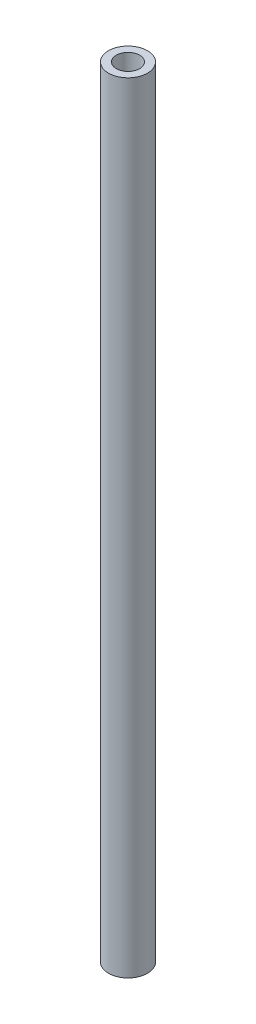
ISO-10303-21;
HEADER;
FILE_DESCRIPTION(('STEP AP214'),'2;1');
FILE_NAME('part.step','',(''),(''),'','','');
FILE_SCHEMA(('AUTOMOTIVE_DESIGN { 1 0 10303 214 1 1 1 1 }'));
ENDSEC;
DATA;
#1=APPLICATION_CONTEXT('core data for automotive mechanical design processes');
#2=APPLICATION_PROTOCOL_DEFINITION('international standard','automotive_design',2000,#1);
#3=PRODUCT_CONTEXT('',#1,'mechanical');
#4=PRODUCT('Part','Part','',(#3));
#5=PRODUCT_RELATED_PRODUCT_CATEGORY('part','',(#4));
#6=PRODUCT_DEFINITION_FORMATION('','',#4);
#7=PRODUCT_DEFINITION_CONTEXT('part definition',#1,'design');
#8=PRODUCT_DEFINITION('design','',#6,#7);
#9=PRODUCT_DEFINITION_SHAPE('','',#8);
#10=(LENGTH_UNIT() NAMED_UNIT(*) SI_UNIT(.MILLI.,.METRE.));
#11=(NAMED_UNIT(*) PLANE_ANGLE_UNIT() SI_UNIT($,.RADIAN.));
#12=(NAMED_UNIT(*) SI_UNIT($,.STERADIAN.) SOLID_ANGLE_UNIT());
#13=UNCERTAINTY_MEASURE_WITH_UNIT(LENGTH_MEASURE(1.E-05),#10,'distance_accuracy_value','');
#14=(GEOMETRIC_REPRESENTATION_CONTEXT(3) GLOBAL_UNCERTAINTY_ASSIGNED_CONTEXT((#13)) GLOBAL_UNIT_ASSIGNED_CONTEXT((#10,
#11,#12)) REPRESENTATION_CONTEXT('',''));
#15=CARTESIAN_POINT('',(0.,0.,0.));
#16=DIRECTION('',(0.,0.,1.));
#17=DIRECTION('',(1.,0.,0.));
#18=AXIS2_PLACEMENT_3D('',#15,#16,#17);
#19=CARTESIAN_POINT('',(0.,100.,0.));
#20=DIRECTION('',(0.,1.,0.));
#21=DIRECTION('',(0.,0.,1.));
#22=AXIS2_PLACEMENT_3D('',#19,#20,#21);
#23=PLANE('',#22);
#24=CARTESIAN_POINT('',(0.,100.,0.));
#25=DIRECTION('',(0.,1.,0.));
#26=DIRECTION('',(0.,0.,1.));
#27=AXIS2_PLACEMENT_3D('',#24,#25,#26);
#28=CIRCLE('',#27,2.5);
#29=CARTESIAN_POINT('',(0.,100.,2.5));
#30=VERTEX_POINT('',#29);
#31=EDGE_CURVE('E10',#30,#30,#28,.T.);
#32=ORIENTED_EDGE('',*,*,#31,.T.);
#33=EDGE_LOOP('',(#32));
#34=FACE_BOUND('',#33,.T.);
#35=CARTESIAN_POINT('',(0.,100.,0.));
#36=DIRECTION('',(0.,1.,0.));
#37=DIRECTION('',(0.,0.,1.));
#38=AXIS2_PLACEMENT_3D('',#35,#36,#37);
#39=CIRCLE('',#38,1.5);
#40=CARTESIAN_POINT('',(0.,100.,1.5));
#41=VERTEX_POINT('',#40);
#42=EDGE_CURVE('E44',#41,#41,#39,.T.);
#43=ORIENTED_EDGE('',*,*,#42,.F.);
#44=EDGE_LOOP('',(#43));
#45=FACE_BOUND('',#44,.T.);
#46=ADVANCED_FACE('F33',(#34,#45),#23,.T.);
#47=CARTESIAN_POINT('',(0.,0.,0.));
#48=DIRECTION('',(0.,1.,0.));
#49=DIRECTION('',(0.,0.,1.));
#50=AXIS2_PLACEMENT_3D('',#47,#48,#49);
#51=PLANE('',#50);
#52=CARTESIAN_POINT('',(0.,0.,0.));
#53=DIRECTION('',(0.,1.,0.));
#54=DIRECTION('',(0.,0.,1.));
#55=AXIS2_PLACEMENT_3D('',#52,#53,#54);
#56=CIRCLE('',#55,2.5);
#57=CARTESIAN_POINT('',(0.,0.,2.5));
#58=VERTEX_POINT('',#57);
#59=EDGE_CURVE('E37',#58,#58,#56,.T.);
#60=ORIENTED_EDGE('',*,*,#59,.F.);
#61=EDGE_LOOP('',(#60));
#62=FACE_BOUND('',#61,.T.);
#63=CARTESIAN_POINT('',(0.,0.,0.));
#64=DIRECTION('',(0.,1.,0.));
#65=DIRECTION('',(0.,0.,1.));
#66=AXIS2_PLACEMENT_3D('',#63,#64,#65);
#67=CIRCLE('',#66,1.5);
#68=CARTESIAN_POINT('',(0.,0.,1.5));
#69=VERTEX_POINT('',#68);
#70=EDGE_CURVE('E46',#69,#69,#67,.T.);
#71=ORIENTED_EDGE('',*,*,#70,.T.);
#72=EDGE_LOOP('',(#71));
#73=FACE_BOUND('',#72,.T.);
#74=ADVANCED_FACE('F56',(#62,#73),#51,.F.);
#75=CARTESIAN_POINT('',(0.,100.,0.));
#76=DIRECTION('',(0.,-1.,0.));
#77=DIRECTION('',(0.,0.,-1.));
#78=AXIS2_PLACEMENT_3D('',#75,#76,#77);
#79=CYLINDRICAL_SURFACE('',#78,2.5);
#80=ORIENTED_EDGE('',*,*,#31,.F.);
#81=EDGE_LOOP('',(#80));
#82=FACE_BOUND('',#81,.T.);
#83=ORIENTED_EDGE('',*,*,#59,.T.);
#84=EDGE_LOOP('',(#83));
#85=FACE_BOUND('',#84,.T.);
#86=ADVANCED_FACE('F35',(#82,#85),#79,.T.);
#87=CARTESIAN_POINT('',(0.,100.,0.));
#88=DIRECTION('',(0.,-1.,0.));
#89=DIRECTION('',(0.,0.,-1.));
#90=AXIS2_PLACEMENT_3D('',#87,#88,#89);
#91=CYLINDRICAL_SURFACE('',#90,1.5);
#92=ORIENTED_EDGE('',*,*,#42,.T.);
#93=EDGE_LOOP('',(#92));
#94=FACE_BOUND('',#93,.T.);
#95=ORIENTED_EDGE('',*,*,#70,.F.);
#96=EDGE_LOOP('',(#95));
#97=FACE_BOUND('',#96,.T.);
#98=ADVANCED_FACE('F52',(#94,#97),#91,.F.);
#99=CLOSED_SHELL('',(#46,#74,#86,#98));
#100=MANIFOLD_SOLID_BREP('B2',#99);
#101=ADVANCED_BREP_SHAPE_REPRESENTATION('',(#18,#100),#14);
#102=SHAPE_DEFINITION_REPRESENTATION(#9,#101);
ENDSEC;
END-ISO-10303-21;
